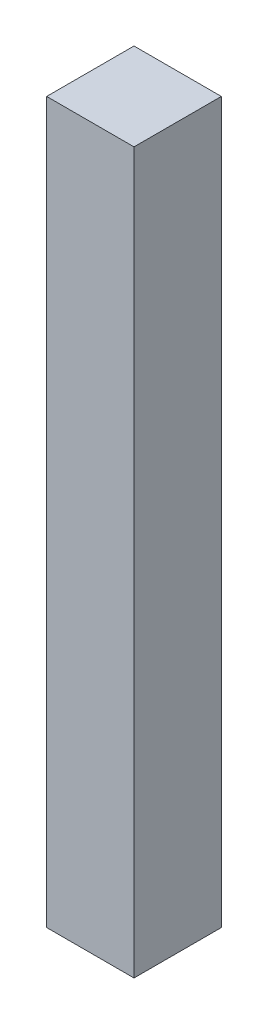
ISO-10303-21;
HEADER;
FILE_DESCRIPTION(('STEP AP214'),'2;1');
FILE_NAME('part.step','',(''),(''),'','','');
FILE_SCHEMA(('AUTOMOTIVE_DESIGN { 1 0 10303 214 1 1 1 1 }'));
ENDSEC;
DATA;
#1=APPLICATION_CONTEXT('core data for automotive mechanical design processes');
#2=APPLICATION_PROTOCOL_DEFINITION('international standard','automotive_design',2000,#1);
#3=PRODUCT_CONTEXT('',#1,'mechanical');
#4=PRODUCT('Part','Part','',(#3));
#5=PRODUCT_RELATED_PRODUCT_CATEGORY('part','',(#4));
#6=PRODUCT_DEFINITION_FORMATION('','',#4);
#7=PRODUCT_DEFINITION_CONTEXT('part definition',#1,'design');
#8=PRODUCT_DEFINITION('design','',#6,#7);
#9=PRODUCT_DEFINITION_SHAPE('','',#8);
#10=(LENGTH_UNIT() NAMED_UNIT(*) SI_UNIT(.MILLI.,.METRE.));
#11=(NAMED_UNIT(*) PLANE_ANGLE_UNIT() SI_UNIT($,.RADIAN.));
#12=(NAMED_UNIT(*) SI_UNIT($,.STERADIAN.) SOLID_ANGLE_UNIT());
#13=UNCERTAINTY_MEASURE_WITH_UNIT(LENGTH_MEASURE(1.E-05),#10,'distance_accuracy_value','');
#14=(GEOMETRIC_REPRESENTATION_CONTEXT(3) GLOBAL_UNCERTAINTY_ASSIGNED_CONTEXT((#13)) GLOBAL_UNIT_ASSIGNED_CONTEXT((#10,
#11,#12)) REPRESENTATION_CONTEXT('',''));
#15=CARTESIAN_POINT('',(0.,0.,0.));
#16=DIRECTION('',(0.,0.,1.));
#17=DIRECTION('',(1.,0.,0.));
#18=AXIS2_PLACEMENT_3D('',#15,#16,#17);
#19=CARTESIAN_POINT('',(0.,193.113458988816,0.));
#20=DIRECTION('',(1.,0.,0.));
#21=DIRECTION('',(0.,0.,-1.));
#22=AXIS2_PLACEMENT_3D('',#19,#20,#21);
#23=PLANE('',#22);
#24=DIRECTION('',(0.,0.,1.));
#25=VECTOR('',#24,1.);
#26=CARTESIAN_POINT('',(0.,164.829187741355,0.));
#27=LINE('',#26,#25);
#28=CARTESIAN_POINT('',(0.,164.829187741355,0.));
#29=VERTEX_POINT('',#28);
#30=CARTESIAN_POINT('',(0.,164.829187741355,20.));
#31=VERTEX_POINT('',#30);
#32=EDGE_CURVE('E11',#29,#31,#27,.T.);
#33=ORIENTED_EDGE('',*,*,#32,.F.);
#34=DIRECTION('',(0.,-1.,0.));
#35=VECTOR('',#34,1.);
#36=CARTESIAN_POINT('',(0.,193.113458988816,0.));
#37=LINE('',#36,#35);
#38=CARTESIAN_POINT('',(0.,0.,0.));
#39=VERTEX_POINT('',#38);
#40=EDGE_CURVE('E92',#29,#39,#37,.T.);
#41=ORIENTED_EDGE('',*,*,#40,.T.);
#42=DIRECTION('',(0.,0.,1.));
#43=VECTOR('',#42,1.);
#44=CARTESIAN_POINT('',(0.,0.,0.));
#45=LINE('',#44,#43);
#46=CARTESIAN_POINT('',(0.,0.,20.));
#47=VERTEX_POINT('',#46);
#48=EDGE_CURVE('E83',#39,#47,#45,.T.);
#49=ORIENTED_EDGE('',*,*,#48,.T.);
#50=DIRECTION('',(0.,-1.,0.));
#51=VECTOR('',#50,1.);
#52=CARTESIAN_POINT('',(0.,193.113458988816,20.));
#53=LINE('',#52,#51);
#54=EDGE_CURVE('E75',#31,#47,#53,.T.);
#55=ORIENTED_EDGE('',*,*,#54,.F.);
#56=EDGE_LOOP('',(#33,#41,#49,#55));
#57=FACE_BOUND('',#56,.T.);
#58=ADVANCED_FACE('F33',(#57),#23,.F.);
#59=CARTESIAN_POINT('',(0.,193.113458988816,20.));
#60=DIRECTION('',(0.,0.,-1.));
#61=DIRECTION('',(-1.,0.,0.));
#62=AXIS2_PLACEMENT_3D('',#59,#60,#61);
#63=PLANE('',#62);
#64=DIRECTION('',(1.,0.,0.));
#65=VECTOR('',#64,1.);
#66=CARTESIAN_POINT('',(0.,164.829187741355,20.));
#67=LINE('',#66,#65);
#68=CARTESIAN_POINT('',(20.,164.829187741355,20.));
#69=VERTEX_POINT('',#68);
#70=EDGE_CURVE('E80',#31,#69,#67,.T.);
#71=ORIENTED_EDGE('',*,*,#70,.F.);
#72=ORIENTED_EDGE('',*,*,#54,.T.);
#73=DIRECTION('',(1.,0.,0.));
#74=VECTOR('',#73,1.);
#75=CARTESIAN_POINT('',(0.,0.,20.));
#76=LINE('',#75,#74);
#77=CARTESIAN_POINT('',(20.,0.,20.));
#78=VERTEX_POINT('',#77);
#79=EDGE_CURVE('E78',#47,#78,#76,.T.);
#80=ORIENTED_EDGE('',*,*,#79,.T.);
#81=DIRECTION('',(0.,-1.,0.));
#82=VECTOR('',#81,1.);
#83=CARTESIAN_POINT('',(20.,193.113458988816,20.));
#84=LINE('',#83,#82);
#85=EDGE_CURVE('E70',#69,#78,#84,.T.);
#86=ORIENTED_EDGE('',*,*,#85,.F.);
#87=EDGE_LOOP('',(#71,#72,#80,#86));
#88=FACE_BOUND('',#87,.T.);
#89=ADVANCED_FACE('F77',(#88),#63,.F.);
#90=CARTESIAN_POINT('',(20.,193.113458988816,0.));
#91=DIRECTION('',(-1.,0.,0.));
#92=DIRECTION('',(0.,0.,1.));
#93=AXIS2_PLACEMENT_3D('',#90,#91,#92);
#94=PLANE('',#93);
#95=DIRECTION('',(0.,0.,-1.));
#96=VECTOR('',#95,1.);
#97=CARTESIAN_POINT('',(20.,164.829187741355,0.));
#98=LINE('',#97,#96);
#99=CARTESIAN_POINT('',(20.,164.829187741355,0.));
#100=VERTEX_POINT('',#99);
#101=EDGE_CURVE('E37',#69,#100,#98,.T.);
#102=ORIENTED_EDGE('',*,*,#101,.F.);
#103=ORIENTED_EDGE('',*,*,#85,.T.);
#104=DIRECTION('',(0.,0.,-1.));
#105=VECTOR('',#104,1.);
#106=CARTESIAN_POINT('',(20.,0.,0.));
#107=LINE('',#106,#105);
#108=CARTESIAN_POINT('',(20.,0.,0.));
#109=VERTEX_POINT('',#108);
#110=EDGE_CURVE('E89',#78,#109,#107,.T.);
#111=ORIENTED_EDGE('',*,*,#110,.T.);
#112=DIRECTION('',(0.,-1.,0.));
#113=VECTOR('',#112,1.);
#114=CARTESIAN_POINT('',(20.,193.113458988816,0.));
#115=LINE('',#114,#113);
#116=EDGE_CURVE('E99',#100,#109,#115,.T.);
#117=ORIENTED_EDGE('',*,*,#116,.F.);
#118=EDGE_LOOP('',(#102,#103,#111,#117));
#119=FACE_BOUND('',#118,.T.);
#120=ADVANCED_FACE('F105',(#119),#94,.F.);
#121=CARTESIAN_POINT('',(0.,193.113458988816,0.));
#122=DIRECTION('',(0.,0.,1.));
#123=DIRECTION('',(1.,0.,0.));
#124=AXIS2_PLACEMENT_3D('',#121,#122,#123);
#125=PLANE('',#124);
#126=DIRECTION('',(-1.,0.,0.));
#127=VECTOR('',#126,1.);
#128=CARTESIAN_POINT('',(0.,164.829187741355,0.));
#129=LINE('',#128,#127);
#130=EDGE_CURVE('E43',#100,#29,#129,.T.);
#131=ORIENTED_EDGE('',*,*,#130,.F.);
#132=ORIENTED_EDGE('',*,*,#116,.T.);
#133=DIRECTION('',(-1.,0.,0.));
#134=VECTOR('',#133,1.);
#135=CARTESIAN_POINT('',(0.,0.,0.));
#136=LINE('',#135,#134);
#137=EDGE_CURVE('E100',#109,#39,#136,.T.);
#138=ORIENTED_EDGE('',*,*,#137,.T.);
#139=ORIENTED_EDGE('',*,*,#40,.F.);
#140=EDGE_LOOP('',(#131,#132,#138,#139));
#141=FACE_BOUND('',#140,.T.);
#142=ADVANCED_FACE('F107',(#141),#125,.F.);
#143=CARTESIAN_POINT('',(0.,0.,0.));
#144=DIRECTION('',(0.,1.,0.));
#145=DIRECTION('',(0.,0.,1.));
#146=AXIS2_PLACEMENT_3D('',#143,#144,#145);
#147=PLANE('',#146);
#148=ORIENTED_EDGE('',*,*,#48,.F.);
#149=ORIENTED_EDGE('',*,*,#137,.F.);
#150=ORIENTED_EDGE('',*,*,#110,.F.);
#151=ORIENTED_EDGE('',*,*,#79,.F.);
#152=EDGE_LOOP('',(#148,#149,#150,#151));
#153=FACE_BOUND('',#152,.T.);
#154=ADVANCED_FACE('F87',(#153),#147,.F.);
#155=CARTESIAN_POINT('',(-20.3321039739281,164.829187741355,0.));
#156=DIRECTION('',(0.,1.,0.));
#157=DIRECTION('',(0.,0.,-1.));
#158=AXIS2_PLACEMENT_3D('',#155,#156,#157);
#159=PLANE('',#158);
#160=ORIENTED_EDGE('',*,*,#70,.T.);
#161=ORIENTED_EDGE('',*,*,#101,.T.);
#162=ORIENTED_EDGE('',*,*,#130,.T.);
#163=ORIENTED_EDGE('',*,*,#32,.T.);
#164=EDGE_LOOP('',(#160,#161,#162,#163));
#165=FACE_BOUND('',#164,.T.);
#166=ADVANCED_FACE('F35',(#165),#159,.T.);
#167=CLOSED_SHELL('',(#58,#89,#120,#142,#154,#166));
#168=MANIFOLD_SOLID_BREP('B2',#167);
#169=ADVANCED_BREP_SHAPE_REPRESENTATION('',(#18,#168),#14);
#170=SHAPE_DEFINITION_REPRESENTATION(#9,#169);
ENDSEC;
END-ISO-10303-21;
